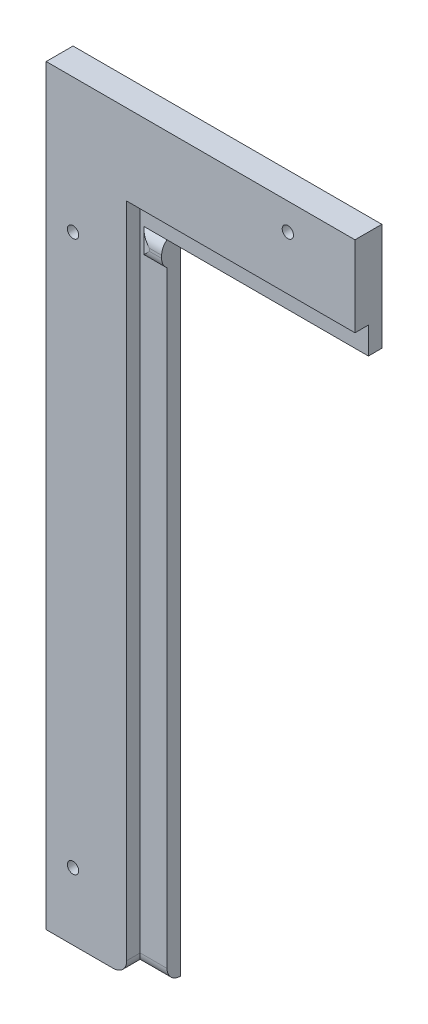
ISO-10303-21;
HEADER;
FILE_DESCRIPTION(('STEP AP214'),'2;1');
FILE_NAME('part.step','',(''),(''),'','','');
FILE_SCHEMA(('AUTOMOTIVE_DESIGN { 1 0 10303 214 1 1 1 1 }'));
ENDSEC;
DATA;
#1=APPLICATION_CONTEXT('core data for automotive mechanical design processes');
#2=APPLICATION_PROTOCOL_DEFINITION('international standard','automotive_design',2000,#1);
#3=PRODUCT_CONTEXT('',#1,'mechanical');
#4=PRODUCT('Part','Part','',(#3));
#5=PRODUCT_RELATED_PRODUCT_CATEGORY('part','',(#4));
#6=PRODUCT_DEFINITION_FORMATION('','',#4);
#7=PRODUCT_DEFINITION_CONTEXT('part definition',#1,'design');
#8=PRODUCT_DEFINITION('design','',#6,#7);
#9=PRODUCT_DEFINITION_SHAPE('','',#8);
#10=(LENGTH_UNIT() NAMED_UNIT(*) SI_UNIT(.MILLI.,.METRE.));
#11=(NAMED_UNIT(*) PLANE_ANGLE_UNIT() SI_UNIT($,.RADIAN.));
#12=(NAMED_UNIT(*) SI_UNIT($,.STERADIAN.) SOLID_ANGLE_UNIT());
#13=UNCERTAINTY_MEASURE_WITH_UNIT(LENGTH_MEASURE(1.E-05),#10,'distance_accuracy_value','');
#14=(GEOMETRIC_REPRESENTATION_CONTEXT(3) GLOBAL_UNCERTAINTY_ASSIGNED_CONTEXT((#13)) GLOBAL_UNIT_ASSIGNED_CONTEXT((#10,
#11,#12)) REPRESENTATION_CONTEXT('',''));
#15=CARTESIAN_POINT('',(0.,0.,0.));
#16=DIRECTION('',(0.,0.,1.));
#17=DIRECTION('',(1.,0.,0.));
#18=AXIS2_PLACEMENT_3D('',#15,#16,#17);
#19=CARTESIAN_POINT('',(75.,145.,427.));
#20=DIRECTION('',(0.,0.,-1.));
#21=DIRECTION('',(-1.,0.,0.));
#22=AXIS2_PLACEMENT_3D('',#19,#20,#21);
#23=CYLINDRICAL_SURFACE('',#22,2.1);
#24=CARTESIAN_POINT('',(75.,145.,5.));
#25=DIRECTION('',(0.,0.,1.));
#26=DIRECTION('',(1.,0.,0.));
#27=AXIS2_PLACEMENT_3D('',#24,#25,#26);
#28=CIRCLE('',#27,2.1);
#29=CARTESIAN_POINT('',(77.1,145.,5.));
#30=VERTEX_POINT('',#29);
#31=EDGE_CURVE('E222',#30,#30,#28,.T.);
#32=ORIENTED_EDGE('',*,*,#31,.T.);
#33=EDGE_LOOP('',(#32));
#34=FACE_BOUND('',#33,.T.);
#35=CARTESIAN_POINT('',(75.,145.,-1.));
#36=DIRECTION('',(0.,0.,-1.));
#37=DIRECTION('',(-1.,0.,0.));
#38=AXIS2_PLACEMENT_3D('',#35,#36,#37);
#39=CIRCLE('',#38,2.1);
#40=CARTESIAN_POINT('',(72.9,145.,-1.));
#41=VERTEX_POINT('',#40);
#42=EDGE_CURVE('E49',#41,#41,#39,.F.);
#43=ORIENTED_EDGE('',*,*,#42,.F.);
#44=EDGE_LOOP('',(#43));
#45=FACE_BOUND('',#44,.T.);
#46=ADVANCED_FACE('F45',(#34,#45),#23,.F.);
#47=CARTESIAN_POINT('',(-4.99999999999999,105.,427.));
#48=DIRECTION('',(0.,0.,-1.));
#49=DIRECTION('',(-1.,0.,0.));
#50=AXIS2_PLACEMENT_3D('',#47,#48,#49);
#51=CYLINDRICAL_SURFACE('',#50,2.1);
#52=CARTESIAN_POINT('',(-4.99999999999999,105.,5.));
#53=DIRECTION('',(0.,0.,1.));
#54=DIRECTION('',(1.,0.,0.));
#55=AXIS2_PLACEMENT_3D('',#52,#53,#54);
#56=CIRCLE('',#55,2.1);
#57=CARTESIAN_POINT('',(-2.89999999999998,105.,5.));
#58=VERTEX_POINT('',#57);
#59=EDGE_CURVE('E226',#58,#58,#56,.T.);
#60=ORIENTED_EDGE('',*,*,#59,.T.);
#61=EDGE_LOOP('',(#60));
#62=FACE_BOUND('',#61,.T.);
#63=CARTESIAN_POINT('',(-4.99999999999999,105.,-1.));
#64=DIRECTION('',(0.,0.,-1.));
#65=DIRECTION('',(-1.,0.,0.));
#66=AXIS2_PLACEMENT_3D('',#63,#64,#65);
#67=CIRCLE('',#66,2.1);
#68=CARTESIAN_POINT('',(-7.09999999999999,105.,-1.));
#69=VERTEX_POINT('',#68);
#70=EDGE_CURVE('E213',#69,#69,#67,.F.);
#71=ORIENTED_EDGE('',*,*,#70,.F.);
#72=EDGE_LOOP('',(#71));
#73=FACE_BOUND('',#72,.T.);
#74=ADVANCED_FACE('F365',(#62,#73),#51,.F.);
#75=CARTESIAN_POINT('',(-4.99999999999999,-100.,427.));
#76=DIRECTION('',(0.,0.,-1.));
#77=DIRECTION('',(-1.,0.,0.));
#78=AXIS2_PLACEMENT_3D('',#75,#76,#77);
#79=CYLINDRICAL_SURFACE('',#78,2.1);
#80=CARTESIAN_POINT('',(-4.99999999999999,-100.,5.));
#81=DIRECTION('',(0.,0.,1.));
#82=DIRECTION('',(1.,0.,0.));
#83=AXIS2_PLACEMENT_3D('',#80,#81,#82);
#84=CIRCLE('',#83,2.1);
#85=CARTESIAN_POINT('',(-2.89999999999998,-100.,5.));
#86=VERTEX_POINT('',#85);
#87=EDGE_CURVE('E210',#86,#86,#84,.T.);
#88=ORIENTED_EDGE('',*,*,#87,.T.);
#89=EDGE_LOOP('',(#88));
#90=FACE_BOUND('',#89,.T.);
#91=CARTESIAN_POINT('',(-4.99999999999999,-100.,-1.));
#92=DIRECTION('',(0.,0.,-1.));
#93=DIRECTION('',(-1.,0.,0.));
#94=AXIS2_PLACEMENT_3D('',#91,#92,#93);
#95=CIRCLE('',#94,2.1);
#96=CARTESIAN_POINT('',(-7.09999999999999,-100.,-1.));
#97=VERTEX_POINT('',#96);
#98=EDGE_CURVE('E211',#97,#97,#95,.F.);
#99=ORIENTED_EDGE('',*,*,#98,.F.);
#100=EDGE_LOOP('',(#99));
#101=FACE_BOUND('',#100,.T.);
#102=ADVANCED_FACE('F370',(#90,#101),#79,.F.);
#103=CARTESIAN_POINT('',(15.,115.,0.));
#104=DIRECTION('',(0.,0.,-1.));
#105=DIRECTION('',(-1.,0.,0.));
#106=AXIS2_PLACEMENT_3D('',#103,#104,#105);
#107=PLANE('',#106);
#108=DIRECTION('',(0.,1.,0.));
#109=VECTOR('',#108,1.);
#110=CARTESIAN_POINT('',(15.,115.,0.));
#111=LINE('',#110,#109);
#112=CARTESIAN_POINT('',(15.,-120.,0.));
#113=VERTEX_POINT('',#112);
#114=CARTESIAN_POINT('',(15.,125.,0.));
#115=VERTEX_POINT('',#114);
#116=EDGE_CURVE('E172',#113,#115,#111,.T.);
#117=ORIENTED_EDGE('',*,*,#116,.F.);
#118=DIRECTION('',(-1.,0.,0.));
#119=VECTOR('',#118,1.);
#120=CARTESIAN_POINT('',(25.,-120.,0.));
#121=LINE('',#120,#119);
#122=CARTESIAN_POINT('',(25.,-120.,0.));
#123=VERTEX_POINT('',#122);
#124=EDGE_CURVE('E54',#113,#123,#121,.F.);
#125=ORIENTED_EDGE('',*,*,#124,.T.);
#126=DIRECTION('',(0.,-1.,0.));
#127=VECTOR('',#126,1.);
#128=CARTESIAN_POINT('',(25.,115.,0.));
#129=LINE('',#128,#127);
#130=CARTESIAN_POINT('',(25.,106.,0.));
#131=VERTEX_POINT('',#130);
#132=EDGE_CURVE('E182',#131,#123,#129,.T.);
#133=ORIENTED_EDGE('',*,*,#132,.F.);
#134=DIRECTION('',(1.,0.,0.));
#135=VECTOR('',#134,1.);
#136=CARTESIAN_POINT('',(25.,106.,0.));
#137=LINE('',#136,#135);
#138=CARTESIAN_POINT('',(16.5,106.,0.));
#139=VERTEX_POINT('',#138);
#140=EDGE_CURVE('E240',#139,#131,#137,.T.);
#141=ORIENTED_EDGE('',*,*,#140,.F.);
#142=DIRECTION('',(0.,-1.,0.));
#143=VECTOR('',#142,1.);
#144=CARTESIAN_POINT('',(16.5,115.,0.));
#145=LINE('',#144,#143);
#146=CARTESIAN_POINT('',(16.5,115.,0.));
#147=VERTEX_POINT('',#146);
#148=EDGE_CURVE('E156',#147,#139,#145,.T.);
#149=ORIENTED_EDGE('',*,*,#148,.F.);
#150=DIRECTION('',(-1.,0.,0.));
#151=VECTOR('',#150,1.);
#152=CARTESIAN_POINT('',(25.,115.,0.));
#153=LINE('',#152,#151);
#154=CARTESIAN_POINT('',(25.,115.,0.));
#155=VERTEX_POINT('',#154);
#156=EDGE_CURVE('E150',#155,#147,#153,.T.);
#157=ORIENTED_EDGE('',*,*,#156,.F.);
#158=DIRECTION('',(-1.,0.,0.));
#159=VECTOR('',#158,1.);
#160=CARTESIAN_POINT('',(15.,115.,0.));
#161=LINE('',#160,#159);
#162=CARTESIAN_POINT('',(100.,115.,0.));
#163=VERTEX_POINT('',#162);
#164=EDGE_CURVE('E154',#163,#155,#161,.T.);
#165=ORIENTED_EDGE('',*,*,#164,.F.);
#166=DIRECTION('',(0.,1.,0.));
#167=VECTOR('',#166,1.);
#168=CARTESIAN_POINT('',(100.,115.,0.));
#169=LINE('',#168,#167);
#170=CARTESIAN_POINT('',(100.,125.,0.));
#171=VERTEX_POINT('',#170);
#172=EDGE_CURVE('E259',#163,#171,#169,.T.);
#173=ORIENTED_EDGE('',*,*,#172,.T.);
#174=DIRECTION('',(-1.,0.,0.));
#175=VECTOR('',#174,1.);
#176=CARTESIAN_POINT('',(15.,125.,0.));
#177=LINE('',#176,#175);
#178=EDGE_CURVE('E251',#171,#115,#177,.T.);
#179=ORIENTED_EDGE('',*,*,#178,.T.);
#180=EDGE_LOOP('',(#117,#125,#133,#141,#149,#157,#165,#173,#179));
#181=FACE_BOUND('',#180,.T.);
#182=ADVANCED_FACE('F152',(#181),#107,.F.);
#183=CARTESIAN_POINT('',(15.,0.,5.));
#184=DIRECTION('',(1.,0.,0.));
#185=DIRECTION('',(0.,1.,0.));
#186=AXIS2_PLACEMENT_3D('',#183,#184,#185);
#187=PLANE('',#186);
#188=DIRECTION('',(0.,-1.,0.));
#189=VECTOR('',#188,1.);
#190=CARTESIAN_POINT('',(15.,0.,5.));
#191=LINE('',#190,#189);
#192=CARTESIAN_POINT('',(15.,125.,5.));
#193=VERTEX_POINT('',#192);
#194=CARTESIAN_POINT('',(15.,-120.,5.));
#195=VERTEX_POINT('',#194);
#196=EDGE_CURVE('E277',#193,#195,#191,.T.);
#197=ORIENTED_EDGE('',*,*,#196,.T.);
#198=DIRECTION('',(0.,0.,-1.));
#199=VECTOR('',#198,1.);
#200=CARTESIAN_POINT('',(15.,-120.,5.));
#201=LINE('',#200,#199);
#202=EDGE_CURVE('E188',#195,#113,#201,.T.);
#203=ORIENTED_EDGE('',*,*,#202,.T.);
#204=ORIENTED_EDGE('',*,*,#116,.T.);
#205=DIRECTION('',(0.,0.,-1.));
#206=VECTOR('',#205,1.);
#207=CARTESIAN_POINT('',(15.,125.,5.));
#208=LINE('',#207,#206);
#209=EDGE_CURVE('E280',#193,#115,#208,.T.);
#210=ORIENTED_EDGE('',*,*,#209,.F.);
#211=EDGE_LOOP('',(#197,#203,#204,#210));
#212=FACE_BOUND('',#211,.T.);
#213=ADVANCED_FACE('F336',(#212),#187,.T.);
#214=CARTESIAN_POINT('',(0.,115.,0.));
#215=DIRECTION('',(0.,1.,0.));
#216=DIRECTION('',(-1.,0.,0.));
#217=AXIS2_PLACEMENT_3D('',#214,#215,#216);
#218=PLANE('',#217);
#219=DIRECTION('',(0.,0.,1.));
#220=VECTOR('',#219,1.);
#221=CARTESIAN_POINT('',(25.,115.,-5.));
#222=LINE('',#221,#220);
#223=CARTESIAN_POINT('',(25.,115.,-5.));
#224=VERTEX_POINT('',#223);
#225=EDGE_CURVE('E166',#224,#155,#222,.T.);
#226=ORIENTED_EDGE('',*,*,#225,.F.);
#227=DIRECTION('',(1.,0.,0.));
#228=VECTOR('',#227,1.);
#229=CARTESIAN_POINT('',(15.,115.,-5.));
#230=LINE('',#229,#228);
#231=CARTESIAN_POINT('',(100.,115.,-5.));
#232=VERTEX_POINT('',#231);
#233=EDGE_CURVE('E252',#224,#232,#230,.T.);
#234=ORIENTED_EDGE('',*,*,#233,.T.);
#235=DIRECTION('',(0.,0.,1.));
#236=VECTOR('',#235,1.);
#237=CARTESIAN_POINT('',(100.,115.,-5.));
#238=LINE('',#237,#236);
#239=EDGE_CURVE('E169',#232,#163,#238,.T.);
#240=ORIENTED_EDGE('',*,*,#239,.T.);
#241=ORIENTED_EDGE('',*,*,#164,.T.);
#242=EDGE_LOOP('',(#226,#234,#240,#241));
#243=FACE_BOUND('',#242,.T.);
#244=ADVANCED_FACE('F165',(#243),#218,.F.);
#245=CARTESIAN_POINT('',(0.,125.,5.));
#246=DIRECTION('',(0.,1.,0.));
#247=DIRECTION('',(-1.,0.,0.));
#248=AXIS2_PLACEMENT_3D('',#245,#246,#247);
#249=PLANE('',#248);
#250=ORIENTED_EDGE('',*,*,#178,.F.);
#251=DIRECTION('',(0.,0.,-1.));
#252=VECTOR('',#251,1.);
#253=CARTESIAN_POINT('',(100.,125.,5.));
#254=LINE('',#253,#252);
#255=CARTESIAN_POINT('',(100.,125.,5.));
#256=VERTEX_POINT('',#255);
#257=EDGE_CURVE('E302',#256,#171,#254,.T.);
#258=ORIENTED_EDGE('',*,*,#257,.F.);
#259=DIRECTION('',(1.,0.,0.));
#260=VECTOR('',#259,1.);
#261=CARTESIAN_POINT('',(0.,125.,5.));
#262=LINE('',#261,#260);
#263=EDGE_CURVE('E262',#193,#256,#262,.T.);
#264=ORIENTED_EDGE('',*,*,#263,.F.);
#265=ORIENTED_EDGE('',*,*,#209,.T.);
#266=EDGE_LOOP('',(#250,#258,#264,#265));
#267=FACE_BOUND('',#266,.T.);
#268=ADVANCED_FACE('F340',(#267),#249,.F.);
#269=CARTESIAN_POINT('',(100.,0.,5.));
#270=DIRECTION('',(-1.,0.,0.));
#271=DIRECTION('',(0.,0.,1.));
#272=AXIS2_PLACEMENT_3D('',#269,#270,#271);
#273=PLANE('',#272);
#274=DIRECTION('',(0.,1.,0.));
#275=VECTOR('',#274,1.);
#276=CARTESIAN_POINT('',(100.,0.,-5.));
#277=LINE('',#276,#275);
#278=CARTESIAN_POINT('',(100.,155.,-5.));
#279=VERTEX_POINT('',#278);
#280=EDGE_CURVE('E261',#232,#279,#277,.T.);
#281=ORIENTED_EDGE('',*,*,#280,.T.);
#282=DIRECTION('',(0.,0.,-1.));
#283=VECTOR('',#282,1.);
#284=CARTESIAN_POINT('',(100.,155.,5.));
#285=LINE('',#284,#283);
#286=CARTESIAN_POINT('',(100.,155.,5.));
#287=VERTEX_POINT('',#286);
#288=EDGE_CURVE('E300',#287,#279,#285,.T.);
#289=ORIENTED_EDGE('',*,*,#288,.F.);
#290=DIRECTION('',(0.,1.,0.));
#291=VECTOR('',#290,1.);
#292=CARTESIAN_POINT('',(100.,0.,5.));
#293=LINE('',#292,#291);
#294=EDGE_CURVE('E265',#256,#287,#293,.T.);
#295=ORIENTED_EDGE('',*,*,#294,.F.);
#296=ORIENTED_EDGE('',*,*,#257,.T.);
#297=ORIENTED_EDGE('',*,*,#172,.F.);
#298=ORIENTED_EDGE('',*,*,#239,.F.);
#299=EDGE_LOOP('',(#281,#289,#295,#296,#297,#298));
#300=FACE_BOUND('',#299,.T.);
#301=ADVANCED_FACE('F344',(#300),#273,.F.);
#302=CARTESIAN_POINT('',(0.,155.,5.));
#303=DIRECTION('',(0.,1.,0.));
#304=DIRECTION('',(0.,0.,1.));
#305=AXIS2_PLACEMENT_3D('',#302,#303,#304);
#306=PLANE('',#305);
#307=DIRECTION('',(1.,0.,0.));
#308=VECTOR('',#307,1.);
#309=CARTESIAN_POINT('',(0.,155.,-5.));
#310=LINE('',#309,#308);
#311=CARTESIAN_POINT('',(-15.,155.,-5.));
#312=VERTEX_POINT('',#311);
#313=EDGE_CURVE('E283',#312,#279,#310,.T.);
#314=ORIENTED_EDGE('',*,*,#313,.F.);
#315=DIRECTION('',(0.,0.,-1.));
#316=VECTOR('',#315,1.);
#317=CARTESIAN_POINT('',(-15.,155.,5.));
#318=LINE('',#317,#316);
#319=CARTESIAN_POINT('',(-15.,155.,5.));
#320=VERTEX_POINT('',#319);
#321=EDGE_CURVE('E298',#320,#312,#318,.T.);
#322=ORIENTED_EDGE('',*,*,#321,.F.);
#323=DIRECTION('',(1.,0.,0.));
#324=VECTOR('',#323,1.);
#325=CARTESIAN_POINT('',(0.,155.,5.));
#326=LINE('',#325,#324);
#327=EDGE_CURVE('E268',#320,#287,#326,.T.);
#328=ORIENTED_EDGE('',*,*,#327,.T.);
#329=ORIENTED_EDGE('',*,*,#288,.T.);
#330=EDGE_LOOP('',(#314,#322,#328,#329));
#331=FACE_BOUND('',#330,.T.);
#332=ADVANCED_FACE('F348',(#331),#306,.T.);
#333=CARTESIAN_POINT('',(-15.,0.,5.));
#334=DIRECTION('',(-1.,0.,0.));
#335=DIRECTION('',(0.,0.,1.));
#336=AXIS2_PLACEMENT_3D('',#333,#334,#335);
#337=PLANE('',#336);
#338=DIRECTION('',(0.,1.,0.));
#339=VECTOR('',#338,1.);
#340=CARTESIAN_POINT('',(-15.,0.,-5.));
#341=LINE('',#340,#339);
#342=CARTESIAN_POINT('',(-15.,-125.,-5.));
#343=VERTEX_POINT('',#342);
#344=EDGE_CURVE('E286',#343,#312,#341,.T.);
#345=ORIENTED_EDGE('',*,*,#344,.F.);
#346=DIRECTION('',(0.,0.,-1.));
#347=VECTOR('',#346,1.);
#348=CARTESIAN_POINT('',(-15.,-125.,5.));
#349=LINE('',#348,#347);
#350=CARTESIAN_POINT('',(-15.,-125.,5.));
#351=VERTEX_POINT('',#350);
#352=EDGE_CURVE('E295',#351,#343,#349,.T.);
#353=ORIENTED_EDGE('',*,*,#352,.F.);
#354=DIRECTION('',(0.,1.,0.));
#355=VECTOR('',#354,1.);
#356=CARTESIAN_POINT('',(-15.,0.,5.));
#357=LINE('',#356,#355);
#358=EDGE_CURVE('E271',#351,#320,#357,.T.);
#359=ORIENTED_EDGE('',*,*,#358,.T.);
#360=ORIENTED_EDGE('',*,*,#321,.T.);
#361=EDGE_LOOP('',(#345,#353,#359,#360));
#362=FACE_BOUND('',#361,.T.);
#363=ADVANCED_FACE('F351',(#362),#337,.T.);
#364=CARTESIAN_POINT('',(0.,-125.,5.));
#365=DIRECTION('',(0.,-1.,0.));
#366=DIRECTION('',(0.,0.,-1.));
#367=AXIS2_PLACEMENT_3D('',#364,#365,#366);
#368=PLANE('',#367);
#369=DIRECTION('',(-1.,0.,0.));
#370=VECTOR('',#369,1.);
#371=CARTESIAN_POINT('',(0.,-125.,-5.));
#372=LINE('',#371,#370);
#373=CARTESIAN_POINT('',(10.,-125.,-5.));
#374=VERTEX_POINT('',#373);
#375=EDGE_CURVE('E290',#374,#343,#372,.T.);
#376=ORIENTED_EDGE('',*,*,#375,.F.);
#377=DIRECTION('',(0.,0.,-1.));
#378=VECTOR('',#377,1.);
#379=CARTESIAN_POINT('',(10.,-125.,5.));
#380=LINE('',#379,#378);
#381=CARTESIAN_POINT('',(10.,-125.,5.));
#382=VERTEX_POINT('',#381);
#383=EDGE_CURVE('E69',#374,#382,#380,.F.);
#384=ORIENTED_EDGE('',*,*,#383,.T.);
#385=DIRECTION('',(-1.,0.,0.));
#386=VECTOR('',#385,1.);
#387=CARTESIAN_POINT('',(0.,-125.,5.));
#388=LINE('',#387,#386);
#389=EDGE_CURVE('E275',#382,#351,#388,.T.);
#390=ORIENTED_EDGE('',*,*,#389,.T.);
#391=ORIENTED_EDGE('',*,*,#352,.T.);
#392=EDGE_LOOP('',(#376,#384,#390,#391));
#393=FACE_BOUND('',#392,.T.);
#394=ADVANCED_FACE('F353',(#393),#368,.T.);
#395=CARTESIAN_POINT('',(0.,0.,5.));
#396=DIRECTION('',(0.,0.,1.));
#397=DIRECTION('',(1.,0.,0.));
#398=AXIS2_PLACEMENT_3D('',#395,#396,#397);
#399=PLANE('',#398);
#400=ORIENTED_EDGE('',*,*,#87,.F.);
#401=EDGE_LOOP('',(#400));
#402=FACE_BOUND('',#401,.T.);
#403=ORIENTED_EDGE('',*,*,#59,.F.);
#404=EDGE_LOOP('',(#403));
#405=FACE_BOUND('',#404,.T.);
#406=ORIENTED_EDGE('',*,*,#31,.F.);
#407=EDGE_LOOP('',(#406));
#408=FACE_BOUND('',#407,.T.);
#409=ORIENTED_EDGE('',*,*,#389,.F.);
#410=CARTESIAN_POINT('',(10.,-120.,5.));
#411=DIRECTION('',(0.,0.,1.));
#412=DIRECTION('',(1.,0.,0.));
#413=AXIS2_PLACEMENT_3D('',#410,#411,#412);
#414=CIRCLE('',#413,5.);
#415=EDGE_CURVE('E206',#382,#195,#414,.T.);
#416=ORIENTED_EDGE('',*,*,#415,.T.);
#417=ORIENTED_EDGE('',*,*,#196,.F.);
#418=ORIENTED_EDGE('',*,*,#263,.T.);
#419=ORIENTED_EDGE('',*,*,#294,.T.);
#420=ORIENTED_EDGE('',*,*,#327,.F.);
#421=ORIENTED_EDGE('',*,*,#358,.F.);
#422=EDGE_LOOP('',(#409,#416,#417,#418,#419,#420,#421));
#423=FACE_BOUND('',#422,.T.);
#424=ADVANCED_FACE('F333',(#402,#405,#408,#423),#399,.T.);
#425=CARTESIAN_POINT('',(0.,0.,-5.));
#426=DIRECTION('',(0.,0.,1.));
#427=DIRECTION('',(1.,0.,0.));
#428=AXIS2_PLACEMENT_3D('',#425,#426,#427);
#429=PLANE('',#428);
#430=CARTESIAN_POINT('',(75.,145.,-5.));
#431=DIRECTION('',(0.,0.,-1.));
#432=DIRECTION('',(-1.,0.,0.));
#433=AXIS2_PLACEMENT_3D('',#430,#431,#432);
#434=CIRCLE('',#433,3.6);
#435=CARTESIAN_POINT('',(71.4,145.,-5.));
#436=VERTEX_POINT('',#435);
#437=EDGE_CURVE('E664',#436,#436,#434,.T.);
#438=ORIENTED_EDGE('',*,*,#437,.F.);
#439=EDGE_LOOP('',(#438));
#440=FACE_BOUND('',#439,.T.);
#441=CARTESIAN_POINT('',(-4.99999999999999,-100.,-5.));
#442=DIRECTION('',(0.,0.,-1.));
#443=DIRECTION('',(-1.,0.,0.));
#444=AXIS2_PLACEMENT_3D('',#441,#442,#443);
#445=CIRCLE('',#444,3.6);
#446=CARTESIAN_POINT('',(-8.59999999999999,-100.,-5.));
#447=VERTEX_POINT('',#446);
#448=EDGE_CURVE('E665',#447,#447,#445,.T.);
#449=ORIENTED_EDGE('',*,*,#448,.F.);
#450=EDGE_LOOP('',(#449));
#451=FACE_BOUND('',#450,.T.);
#452=CARTESIAN_POINT('',(-4.99999999999999,105.,-5.));
#453=DIRECTION('',(0.,0.,-1.));
#454=DIRECTION('',(-1.,0.,0.));
#455=AXIS2_PLACEMENT_3D('',#452,#453,#454);
#456=CIRCLE('',#455,3.6);
#457=CARTESIAN_POINT('',(-8.59999999999999,105.,-5.));
#458=VERTEX_POINT('',#457);
#459=EDGE_CURVE('E673',#458,#458,#456,.T.);
#460=ORIENTED_EDGE('',*,*,#459,.F.);
#461=EDGE_LOOP('',(#460));
#462=FACE_BOUND('',#461,.T.);
#463=DIRECTION('',(0.,1.,0.));
#464=VECTOR('',#463,1.);
#465=CARTESIAN_POINT('',(25.,115.,-5.));
#466=LINE('',#465,#464);
#467=CARTESIAN_POINT('',(25.,-125.,-5.));
#468=VERTEX_POINT('',#467);
#469=EDGE_CURVE('E181',#468,#224,#466,.T.);
#470=ORIENTED_EDGE('',*,*,#469,.F.);
#471=EDGE_CURVE('E266',#468,#374,#372,.T.);
#472=ORIENTED_EDGE('',*,*,#471,.T.);
#473=ORIENTED_EDGE('',*,*,#375,.T.);
#474=ORIENTED_EDGE('',*,*,#344,.T.);
#475=ORIENTED_EDGE('',*,*,#313,.T.);
#476=ORIENTED_EDGE('',*,*,#280,.F.);
#477=ORIENTED_EDGE('',*,*,#233,.F.);
#478=EDGE_LOOP('',(#470,#472,#473,#474,#475,#476,#477));
#479=FACE_BOUND('',#478,.T.);
#480=ADVANCED_FACE('F326',(#440,#451,#462,#479),#429,.F.);
#481=CARTESIAN_POINT('',(25.,0.,0.));
#482=DIRECTION('',(-1.,0.,0.));
#483=DIRECTION('',(0.,-1.,0.));
#484=AXIS2_PLACEMENT_3D('',#481,#482,#483);
#485=PLANE('',#484);
#486=ORIENTED_EDGE('',*,*,#132,.T.);
#487=CARTESIAN_POINT('',(25.,-120.,-5.));
#488=DIRECTION('',(-1.,0.,0.));
#489=DIRECTION('',(0.,-1.,0.));
#490=AXIS2_PLACEMENT_3D('',#487,#488,#489);
#491=CIRCLE('',#490,5.);
#492=EDGE_CURVE('E11',#123,#468,#491,.F.);
#493=ORIENTED_EDGE('',*,*,#492,.T.);
#494=ORIENTED_EDGE('',*,*,#469,.T.);
#495=ORIENTED_EDGE('',*,*,#225,.T.);
#496=CARTESIAN_POINT('',(25.,111.,-3.));
#497=DIRECTION('',(-1.,0.,0.));
#498=DIRECTION('',(0.,-1.,0.));
#499=AXIS2_PLACEMENT_3D('',#496,#497,#498);
#500=CIRCLE('',#499,5.);
#501=CARTESIAN_POINT('',(25.,111.,2.));
#502=VERTEX_POINT('',#501);
#503=EDGE_CURVE('E178',#155,#502,#500,.F.);
#504=ORIENTED_EDGE('',*,*,#503,.T.);
#505=DIRECTION('',(0.,1.,0.));
#506=VECTOR('',#505,1.);
#507=CARTESIAN_POINT('',(25.,115.,2.));
#508=LINE('',#507,#506);
#509=CARTESIAN_POINT('',(25.,110.,2.));
#510=VERTEX_POINT('',#509);
#511=EDGE_CURVE('E239',#510,#502,#508,.T.);
#512=ORIENTED_EDGE('',*,*,#511,.F.);
#513=CARTESIAN_POINT('',(25.,110.,-3.));
#514=DIRECTION('',(-1.,0.,0.));
#515=DIRECTION('',(0.,-1.,0.));
#516=AXIS2_PLACEMENT_3D('',#513,#514,#515);
#517=CIRCLE('',#516,5.);
#518=EDGE_CURVE('E189',#510,#131,#517,.F.);
#519=ORIENTED_EDGE('',*,*,#518,.T.);
#520=EDGE_LOOP('',(#486,#493,#494,#495,#504,#512,#519));
#521=FACE_BOUND('',#520,.T.);
#522=ADVANCED_FACE('F176',(#521),#485,.F.);
#523=CARTESIAN_POINT('',(0.,0.,2.));
#524=DIRECTION('',(0.,0.,-1.));
#525=DIRECTION('',(-1.,0.,0.));
#526=AXIS2_PLACEMENT_3D('',#523,#524,#525);
#527=PLANE('',#526);
#528=ORIENTED_EDGE('',*,*,#511,.T.);
#529=DIRECTION('',(1.,0.,0.));
#530=VECTOR('',#529,1.);
#531=CARTESIAN_POINT('',(0.,111.,2.));
#532=LINE('',#531,#530);
#533=CARTESIAN_POINT('',(20.5,111.,2.));
#534=VERTEX_POINT('',#533);
#535=EDGE_CURVE('E186',#502,#534,#532,.F.);
#536=ORIENTED_EDGE('',*,*,#535,.T.);
#537=DIRECTION('',(0.,1.,0.));
#538=VECTOR('',#537,1.);
#539=CARTESIAN_POINT('',(20.5,0.,2.));
#540=LINE('',#539,#538);
#541=CARTESIAN_POINT('',(20.5,110.,2.));
#542=VERTEX_POINT('',#541);
#543=EDGE_CURVE('E308',#534,#542,#540,.F.);
#544=ORIENTED_EDGE('',*,*,#543,.T.);
#545=DIRECTION('',(-1.,0.,0.));
#546=VECTOR('',#545,1.);
#547=CARTESIAN_POINT('',(0.,110.,2.));
#548=LINE('',#547,#546);
#549=EDGE_CURVE('E305',#542,#510,#548,.F.);
#550=ORIENTED_EDGE('',*,*,#549,.T.);
#551=EDGE_LOOP('',(#528,#536,#544,#550));
#552=FACE_BOUND('',#551,.T.);
#553=ADVANCED_FACE('F312',(#552),#527,.F.);
#554=CARTESIAN_POINT('',(25.,111.,-3.));
#555=DIRECTION('',(1.,0.,0.));
#556=DIRECTION('',(0.,0.,-1.));
#557=AXIS2_PLACEMENT_3D('',#554,#555,#556);
#558=CYLINDRICAL_SURFACE('',#557,5.);
#559=ORIENTED_EDGE('',*,*,#503,.F.);
#560=ORIENTED_EDGE('',*,*,#156,.T.);
#561=CARTESIAN_POINT('',(20.5,111.,-3.));
#562=DIRECTION('',(0.707106781186547,0.707106781186548,0.));
#563=DIRECTION('',(0.707106781186548,-0.707106781186547,0.));
#564=AXIS2_PLACEMENT_3D('',#561,#562,#563);
#565=ELLIPSE('',#564,7.07106781186548,5.);
#566=EDGE_CURVE('E161',#534,#147,#565,.F.);
#567=ORIENTED_EDGE('',*,*,#566,.F.);
#568=ORIENTED_EDGE('',*,*,#535,.F.);
#569=EDGE_LOOP('',(#559,#560,#567,#568));
#570=FACE_BOUND('',#569,.T.);
#571=ADVANCED_FACE('F185',(#570),#558,.T.);
#572=CARTESIAN_POINT('',(25.,110.,-3.));
#573=DIRECTION('',(-1.,0.,0.));
#574=DIRECTION('',(0.,0.,1.));
#575=AXIS2_PLACEMENT_3D('',#572,#573,#574);
#576=CYLINDRICAL_SURFACE('',#575,5.);
#577=ORIENTED_EDGE('',*,*,#518,.F.);
#578=ORIENTED_EDGE('',*,*,#549,.F.);
#579=CARTESIAN_POINT('',(20.5,110.,-3.));
#580=DIRECTION('',(-0.707106781186548,0.707106781186547,0.));
#581=DIRECTION('',(-0.707106781186547,-0.707106781186548,0.));
#582=AXIS2_PLACEMENT_3D('',#579,#580,#581);
#583=ELLIPSE('',#582,7.07106781186547,5.);
#584=EDGE_CURVE('E199',#139,#542,#583,.T.);
#585=ORIENTED_EDGE('',*,*,#584,.F.);
#586=ORIENTED_EDGE('',*,*,#140,.T.);
#587=EDGE_LOOP('',(#577,#578,#585,#586));
#588=FACE_BOUND('',#587,.T.);
#589=ADVANCED_FACE('F320',(#588),#576,.T.);
#590=CARTESIAN_POINT('',(20.5,115.,-3.));
#591=DIRECTION('',(0.,1.,0.));
#592=DIRECTION('',(-1.,0.,0.));
#593=AXIS2_PLACEMENT_3D('',#590,#591,#592);
#594=CYLINDRICAL_SURFACE('',#593,5.);
#595=ORIENTED_EDGE('',*,*,#566,.T.);
#596=ORIENTED_EDGE('',*,*,#148,.T.);
#597=ORIENTED_EDGE('',*,*,#584,.T.);
#598=ORIENTED_EDGE('',*,*,#543,.F.);
#599=EDGE_LOOP('',(#595,#596,#597,#598));
#600=FACE_BOUND('',#599,.T.);
#601=ADVANCED_FACE('F315',(#600),#594,.T.);
#602=CARTESIAN_POINT('',(0.,-120.,-5.));
#603=DIRECTION('',(1.,0.,0.));
#604=DIRECTION('',(0.,0.,-1.));
#605=AXIS2_PLACEMENT_3D('',#602,#603,#604);
#606=CYLINDRICAL_SURFACE('',#605,5.);
#607=ORIENTED_EDGE('',*,*,#492,.F.);
#608=ORIENTED_EDGE('',*,*,#124,.F.);
#609=CARTESIAN_POINT('',(10.,-120.,-5.));
#610=DIRECTION('',(0.707106781186547,0.,-0.707106781186547));
#611=DIRECTION('',(-0.707106781186547,0.,-0.707106781186547));
#612=AXIS2_PLACEMENT_3D('',#609,#610,#611);
#613=ELLIPSE('',#612,7.07106781186547,5.);
#614=EDGE_CURVE('E202',#374,#113,#613,.F.);
#615=ORIENTED_EDGE('',*,*,#614,.F.);
#616=ORIENTED_EDGE('',*,*,#471,.F.);
#617=EDGE_LOOP('',(#607,#608,#615,#616));
#618=FACE_BOUND('',#617,.T.);
#619=ADVANCED_FACE('F47',(#618),#606,.T.);
#620=CARTESIAN_POINT('',(10.,-120.,5.));
#621=DIRECTION('',(0.,0.,-1.));
#622=DIRECTION('',(-1.,0.,0.));
#623=AXIS2_PLACEMENT_3D('',#620,#621,#622);
#624=CYLINDRICAL_SURFACE('',#623,5.);
#625=ORIENTED_EDGE('',*,*,#415,.F.);
#626=ORIENTED_EDGE('',*,*,#383,.F.);
#627=ORIENTED_EDGE('',*,*,#614,.T.);
#628=ORIENTED_EDGE('',*,*,#202,.F.);
#629=EDGE_LOOP('',(#625,#626,#627,#628));
#630=FACE_BOUND('',#629,.T.);
#631=ADVANCED_FACE('F329',(#630),#624,.T.);
#632=CARTESIAN_POINT('',(-4.99999999999999,-100.,-1.));
#633=DIRECTION('',(0.,0.,-1.));
#634=DIRECTION('',(-1.,0.,0.));
#635=AXIS2_PLACEMENT_3D('',#632,#633,#634);
#636=PLANE('',#635);
#637=CARTESIAN_POINT('',(-4.99999999999999,-100.,-1.));
#638=DIRECTION('',(0.,0.,-1.));
#639=DIRECTION('',(-1.,0.,0.));
#640=AXIS2_PLACEMENT_3D('',#637,#638,#639);
#641=CIRCLE('',#640,3.6);
#642=CARTESIAN_POINT('',(-8.59999999999999,-100.,-1.));
#643=VERTEX_POINT('',#642);
#644=EDGE_CURVE('E669',#643,#643,#641,.T.);
#645=ORIENTED_EDGE('',*,*,#644,.T.);
#646=EDGE_LOOP('',(#645));
#647=FACE_BOUND('',#646,.T.);
#648=ORIENTED_EDGE('',*,*,#98,.T.);
#649=EDGE_LOOP('',(#648));
#650=FACE_BOUND('',#649,.T.);
#651=ADVANCED_FACE('F539',(#647,#650),#636,.T.);
#652=CARTESIAN_POINT('',(-4.99999999999999,-100.,-1.));
#653=DIRECTION('',(0.,0.,-1.));
#654=DIRECTION('',(-1.,0.,0.));
#655=AXIS2_PLACEMENT_3D('',#652,#653,#654);
#656=CYLINDRICAL_SURFACE('',#655,3.6);
#657=ORIENTED_EDGE('',*,*,#644,.F.);
#658=EDGE_LOOP('',(#657));
#659=FACE_BOUND('',#658,.T.);
#660=ORIENTED_EDGE('',*,*,#448,.T.);
#661=EDGE_LOOP('',(#660));
#662=FACE_BOUND('',#661,.T.);
#663=ADVANCED_FACE('F568',(#659,#662),#656,.F.);
#664=CARTESIAN_POINT('',(-4.99999999999999,105.,-1.));
#665=DIRECTION('',(0.,0.,-1.));
#666=DIRECTION('',(-1.,0.,0.));
#667=AXIS2_PLACEMENT_3D('',#664,#665,#666);
#668=PLANE('',#667);
#669=CARTESIAN_POINT('',(-4.99999999999999,105.,-1.));
#670=DIRECTION('',(0.,0.,-1.));
#671=DIRECTION('',(-1.,0.,0.));
#672=AXIS2_PLACEMENT_3D('',#669,#670,#671);
#673=CIRCLE('',#672,3.6);
#674=CARTESIAN_POINT('',(-8.59999999999999,105.,-1.));
#675=VERTEX_POINT('',#674);
#676=EDGE_CURVE('E234',#675,#675,#673,.T.);
#677=ORIENTED_EDGE('',*,*,#676,.T.);
#678=EDGE_LOOP('',(#677));
#679=FACE_BOUND('',#678,.T.);
#680=ORIENTED_EDGE('',*,*,#70,.T.);
#681=EDGE_LOOP('',(#680));
#682=FACE_BOUND('',#681,.T.);
#683=ADVANCED_FACE('F578',(#679,#682),#668,.T.);
#684=CARTESIAN_POINT('',(-4.99999999999999,105.,-1.));
#685=DIRECTION('',(0.,0.,-1.));
#686=DIRECTION('',(-1.,0.,0.));
#687=AXIS2_PLACEMENT_3D('',#684,#685,#686);
#688=CYLINDRICAL_SURFACE('',#687,3.6);
#689=ORIENTED_EDGE('',*,*,#676,.F.);
#690=EDGE_LOOP('',(#689));
#691=FACE_BOUND('',#690,.T.);
#692=ORIENTED_EDGE('',*,*,#459,.T.);
#693=EDGE_LOOP('',(#692));
#694=FACE_BOUND('',#693,.T.);
#695=ADVANCED_FACE('F588',(#691,#694),#688,.F.);
#696=CARTESIAN_POINT('',(75.,145.,-1.));
#697=DIRECTION('',(0.,0.,-1.));
#698=DIRECTION('',(-1.,0.,0.));
#699=AXIS2_PLACEMENT_3D('',#696,#697,#698);
#700=PLANE('',#699);
#701=CARTESIAN_POINT('',(75.,145.,-1.));
#702=DIRECTION('',(0.,0.,-1.));
#703=DIRECTION('',(-1.,0.,0.));
#704=AXIS2_PLACEMENT_3D('',#701,#702,#703);
#705=CIRCLE('',#704,3.6);
#706=CARTESIAN_POINT('',(71.4,145.,-1.));
#707=VERTEX_POINT('',#706);
#708=EDGE_CURVE('E214',#707,#707,#705,.T.);
#709=ORIENTED_EDGE('',*,*,#708,.T.);
#710=EDGE_LOOP('',(#709));
#711=FACE_BOUND('',#710,.T.);
#712=ORIENTED_EDGE('',*,*,#42,.T.);
#713=EDGE_LOOP('',(#712));
#714=FACE_BOUND('',#713,.T.);
#715=ADVANCED_FACE('F598',(#711,#714),#700,.T.);
#716=CARTESIAN_POINT('',(75.,145.,-1.));
#717=DIRECTION('',(0.,0.,-1.));
#718=DIRECTION('',(-1.,0.,0.));
#719=AXIS2_PLACEMENT_3D('',#716,#717,#718);
#720=CYLINDRICAL_SURFACE('',#719,3.6);
#721=ORIENTED_EDGE('',*,*,#708,.F.);
#722=EDGE_LOOP('',(#721));
#723=FACE_BOUND('',#722,.T.);
#724=ORIENTED_EDGE('',*,*,#437,.T.);
#725=EDGE_LOOP('',(#724));
#726=FACE_BOUND('',#725,.T.);
#727=ADVANCED_FACE('F608',(#723,#726),#720,.F.);
#728=CLOSED_SHELL('',(#46,#74,#102,#182,#213,#244,#268,#301,#332,#363,#394,#424,#480,#522,#553,
#571,#589,#601,#619,#631,#651,#663,#683,#695,#715,#727));
#729=MANIFOLD_SOLID_BREP('B2',#728);
#730=ADVANCED_BREP_SHAPE_REPRESENTATION('',(#18,#729),#14);
#731=SHAPE_DEFINITION_REPRESENTATION(#9,#730);
ENDSEC;
END-ISO-10303-21;
